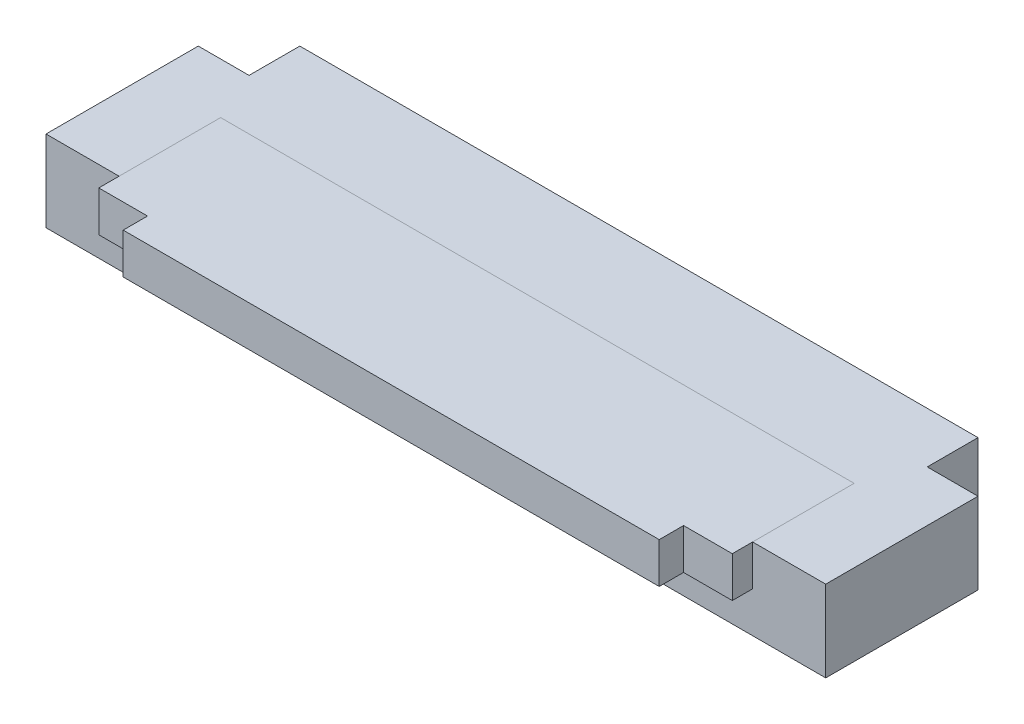
ISO-10303-21;
HEADER;
FILE_DESCRIPTION(('STEP AP214'),'2;1');
FILE_NAME('part.step','',(''),(''),'','','');
FILE_SCHEMA(('AUTOMOTIVE_DESIGN { 1 0 10303 214 1 1 1 1 }'));
ENDSEC;
DATA;
#1=APPLICATION_CONTEXT('core data for automotive mechanical design processes');
#2=APPLICATION_PROTOCOL_DEFINITION('international standard','automotive_design',2000,#1);
#3=PRODUCT_CONTEXT('',#1,'mechanical');
#4=PRODUCT('Part','Part','',(#3));
#5=PRODUCT_RELATED_PRODUCT_CATEGORY('part','',(#4));
#6=PRODUCT_DEFINITION_FORMATION('','',#4);
#7=PRODUCT_DEFINITION_CONTEXT('part definition',#1,'design');
#8=PRODUCT_DEFINITION('design','',#6,#7);
#9=PRODUCT_DEFINITION_SHAPE('','',#8);
#10=(LENGTH_UNIT() NAMED_UNIT(*) SI_UNIT(.MILLI.,.METRE.));
#11=(NAMED_UNIT(*) PLANE_ANGLE_UNIT() SI_UNIT($,.RADIAN.));
#12=(NAMED_UNIT(*) SI_UNIT($,.STERADIAN.) SOLID_ANGLE_UNIT());
#13=UNCERTAINTY_MEASURE_WITH_UNIT(LENGTH_MEASURE(1.E-05),#10,'distance_accuracy_value','');
#14=(GEOMETRIC_REPRESENTATION_CONTEXT(3) GLOBAL_UNCERTAINTY_ASSIGNED_CONTEXT((#13)) GLOBAL_UNIT_ASSIGNED_CONTEXT((#10,
#11,#12)) REPRESENTATION_CONTEXT('',''));
#15=CARTESIAN_POINT('',(0.,0.,0.));
#16=DIRECTION('',(0.,0.,1.));
#17=DIRECTION('',(1.,0.,0.));
#18=AXIS2_PLACEMENT_3D('',#15,#16,#17);
#19=CARTESIAN_POINT('',(-4.8,0.,-1.25));
#20=DIRECTION('',(-1.,0.,0.));
#21=DIRECTION('',(0.,0.,1.));
#22=AXIS2_PLACEMENT_3D('',#19,#20,#21);
#23=PLANE('',#22);
#24=DIRECTION('',(0.,-1.,0.));
#25=VECTOR('',#24,1.);
#26=CARTESIAN_POINT('',(-4.8,1.,-0.625));
#27=LINE('',#26,#25);
#28=CARTESIAN_POINT('',(-4.8,1.,-0.625));
#29=VERTEX_POINT('',#28);
#30=CARTESIAN_POINT('',(-4.8,0.,-0.625));
#31=VERTEX_POINT('',#30);
#32=EDGE_CURVE('E169',#29,#31,#27,.T.);
#33=ORIENTED_EDGE('',*,*,#32,.T.);
#34=DIRECTION('',(0.,0.,1.));
#35=VECTOR('',#34,1.);
#36=CARTESIAN_POINT('',(-4.8,0.,-1.25));
#37=LINE('',#36,#35);
#38=CARTESIAN_POINT('',(-4.8,0.,1.25));
#39=VERTEX_POINT('',#38);
#40=EDGE_CURVE('E194',#31,#39,#37,.T.);
#41=ORIENTED_EDGE('',*,*,#40,.T.);
#42=DIRECTION('',(0.,1.,0.));
#43=VECTOR('',#42,1.);
#44=CARTESIAN_POINT('',(-4.8,0.,1.25));
#45=LINE('',#44,#43);
#46=CARTESIAN_POINT('',(-4.8,1.,1.25));
#47=VERTEX_POINT('',#46);
#48=EDGE_CURVE('E46',#39,#47,#45,.T.);
#49=ORIENTED_EDGE('',*,*,#48,.T.);
#50=DIRECTION('',(0.,0.,1.));
#51=VECTOR('',#50,1.);
#52=CARTESIAN_POINT('',(-4.8,1.,-1.25));
#53=LINE('',#52,#51);
#54=EDGE_CURVE('E190',#29,#47,#53,.T.);
#55=ORIENTED_EDGE('',*,*,#54,.F.);
#56=EDGE_LOOP('',(#33,#41,#49,#55));
#57=FACE_BOUND('',#56,.T.);
#58=ADVANCED_FACE('F43',(#57),#23,.T.);
#59=CARTESIAN_POINT('',(4.8,0.,-1.25));
#60=DIRECTION('',(0.,0.,-1.));
#61=DIRECTION('',(-1.,0.,0.));
#62=AXIS2_PLACEMENT_3D('',#59,#60,#61);
#63=PLANE('',#62);
#64=DIRECTION('',(0.,-1.,0.));
#65=VECTOR('',#64,1.);
#66=CARTESIAN_POINT('',(-4.175,1.,-1.25));
#67=LINE('',#66,#65);
#68=CARTESIAN_POINT('',(-4.175,1.,-1.25));
#69=VERTEX_POINT('',#68);
#70=CARTESIAN_POINT('',(-4.175,0.,-1.25));
#71=VERTEX_POINT('',#70);
#72=EDGE_CURVE('E163',#69,#71,#67,.T.);
#73=ORIENTED_EDGE('',*,*,#72,.F.);
#74=DIRECTION('',(-1.,0.,0.));
#75=VECTOR('',#74,1.);
#76=CARTESIAN_POINT('',(4.8,1.,-1.25));
#77=LINE('',#76,#75);
#78=CARTESIAN_POINT('',(4.175,1.,-1.25));
#79=VERTEX_POINT('',#78);
#80=EDGE_CURVE('E197',#79,#69,#77,.T.);
#81=ORIENTED_EDGE('',*,*,#80,.F.);
#82=DIRECTION('',(0.,-1.,0.));
#83=VECTOR('',#82,1.);
#84=CARTESIAN_POINT('',(4.175,1.,-1.25));
#85=LINE('',#84,#83);
#86=CARTESIAN_POINT('',(4.175,0.,-1.25));
#87=VERTEX_POINT('',#86);
#88=EDGE_CURVE('E187',#79,#87,#85,.T.);
#89=ORIENTED_EDGE('',*,*,#88,.T.);
#90=DIRECTION('',(-1.,0.,0.));
#91=VECTOR('',#90,1.);
#92=CARTESIAN_POINT('',(4.8,0.,-1.25));
#93=LINE('',#92,#91);
#94=EDGE_CURVE('E203',#87,#71,#93,.T.);
#95=ORIENTED_EDGE('',*,*,#94,.T.);
#96=EDGE_LOOP('',(#73,#81,#89,#95));
#97=FACE_BOUND('',#96,.T.);
#98=ADVANCED_FACE('F220',(#97),#63,.T.);
#99=CARTESIAN_POINT('',(4.8,0.,1.25));
#100=DIRECTION('',(1.,0.,0.));
#101=DIRECTION('',(0.,0.,-1.));
#102=AXIS2_PLACEMENT_3D('',#99,#100,#101);
#103=PLANE('',#102);
#104=DIRECTION('',(0.,-1.,0.));
#105=VECTOR('',#104,1.);
#106=CARTESIAN_POINT('',(4.8,1.,-0.625));
#107=LINE('',#106,#105);
#108=CARTESIAN_POINT('',(4.8,1.,-0.625));
#109=VERTEX_POINT('',#108);
#110=CARTESIAN_POINT('',(4.8,0.,-0.625));
#111=VERTEX_POINT('',#110);
#112=EDGE_CURVE('E183',#109,#111,#107,.T.);
#113=ORIENTED_EDGE('',*,*,#112,.F.);
#114=DIRECTION('',(0.,0.,-1.));
#115=VECTOR('',#114,1.);
#116=CARTESIAN_POINT('',(4.8,1.,1.25));
#117=LINE('',#116,#115);
#118=CARTESIAN_POINT('',(4.8,1.,1.25));
#119=VERTEX_POINT('',#118);
#120=EDGE_CURVE('E210',#119,#109,#117,.T.);
#121=ORIENTED_EDGE('',*,*,#120,.F.);
#122=DIRECTION('',(0.,1.,0.));
#123=VECTOR('',#122,1.);
#124=CARTESIAN_POINT('',(4.8,0.,1.25));
#125=LINE('',#124,#123);
#126=CARTESIAN_POINT('',(4.8,0.,1.25));
#127=VERTEX_POINT('',#126);
#128=EDGE_CURVE('E12',#127,#119,#125,.T.);
#129=ORIENTED_EDGE('',*,*,#128,.F.);
#130=DIRECTION('',(0.,0.,-1.));
#131=VECTOR('',#130,1.);
#132=CARTESIAN_POINT('',(4.8,0.,1.25));
#133=LINE('',#132,#131);
#134=EDGE_CURVE('E200',#127,#111,#133,.T.);
#135=ORIENTED_EDGE('',*,*,#134,.T.);
#136=EDGE_LOOP('',(#113,#121,#129,#135));
#137=FACE_BOUND('',#136,.T.);
#138=ADVANCED_FACE('F254',(#137),#103,.T.);
#139=CARTESIAN_POINT('',(-4.8,0.,1.25));
#140=DIRECTION('',(0.,0.,1.));
#141=DIRECTION('',(1.,0.,0.));
#142=AXIS2_PLACEMENT_3D('',#139,#140,#141);
#143=PLANE('',#142);
#144=DIRECTION('',(0.,1.,0.));
#145=VECTOR('',#144,1.);
#146=CARTESIAN_POINT('',(-3.9,0.5,1.25));
#147=LINE('',#146,#145);
#148=CARTESIAN_POINT('',(-3.9,0.5,1.25));
#149=VERTEX_POINT('',#148);
#150=CARTESIAN_POINT('',(-3.9,1.,1.25));
#151=VERTEX_POINT('',#150);
#152=EDGE_CURVE('E167',#149,#151,#147,.T.);
#153=ORIENTED_EDGE('',*,*,#152,.T.);
#154=DIRECTION('',(1.,0.,0.));
#155=VECTOR('',#154,1.);
#156=CARTESIAN_POINT('',(-4.8,1.,1.25));
#157=LINE('',#156,#155);
#158=EDGE_CURVE('E207',#47,#151,#157,.T.);
#159=ORIENTED_EDGE('',*,*,#158,.F.);
#160=ORIENTED_EDGE('',*,*,#48,.F.);
#161=DIRECTION('',(1.,0.,0.));
#162=VECTOR('',#161,1.);
#163=CARTESIAN_POINT('',(-4.8,0.,1.25));
#164=LINE('',#163,#162);
#165=EDGE_CURVE('E196',#39,#127,#164,.T.);
#166=ORIENTED_EDGE('',*,*,#165,.T.);
#167=ORIENTED_EDGE('',*,*,#128,.T.);
#168=CARTESIAN_POINT('',(3.9,1.,1.25));
#169=VERTEX_POINT('',#168);
#170=EDGE_CURVE('E151',#169,#119,#157,.T.);
#171=ORIENTED_EDGE('',*,*,#170,.F.);
#172=DIRECTION('',(0.,1.,0.));
#173=VECTOR('',#172,1.);
#174=CARTESIAN_POINT('',(3.9,0.5,1.25));
#175=LINE('',#174,#173);
#176=CARTESIAN_POINT('',(3.9,0.5,1.25));
#177=VERTEX_POINT('',#176);
#178=EDGE_CURVE('E57',#177,#169,#175,.T.);
#179=ORIENTED_EDGE('',*,*,#178,.F.);
#180=DIRECTION('',(1.,0.,0.));
#181=VECTOR('',#180,1.);
#182=CARTESIAN_POINT('',(-3.9,0.5,1.25));
#183=LINE('',#182,#181);
#184=EDGE_CURVE('E138',#149,#177,#183,.T.);
#185=ORIENTED_EDGE('',*,*,#184,.F.);
#186=EDGE_LOOP('',(#153,#159,#160,#166,#167,#171,#179,#185));
#187=FACE_BOUND('',#186,.T.);
#188=ADVANCED_FACE('F150',(#187),#143,.T.);
#189=CARTESIAN_POINT('',(-4.8,0.,1.25));
#190=DIRECTION('',(0.,1.,0.));
#191=DIRECTION('',(0.,0.,1.));
#192=AXIS2_PLACEMENT_3D('',#189,#190,#191);
#193=PLANE('',#192);
#194=ORIENTED_EDGE('',*,*,#40,.F.);
#195=DIRECTION('',(-1.,0.,0.));
#196=VECTOR('',#195,1.);
#197=CARTESIAN_POINT('',(-4.175,0.,-0.625));
#198=LINE('',#197,#196);
#199=CARTESIAN_POINT('',(-4.175,0.,-0.625));
#200=VERTEX_POINT('',#199);
#201=EDGE_CURVE('E161',#200,#31,#198,.T.);
#202=ORIENTED_EDGE('',*,*,#201,.F.);
#203=DIRECTION('',(0.,0.,1.));
#204=VECTOR('',#203,1.);
#205=CARTESIAN_POINT('',(-4.175,0.,-1.25));
#206=LINE('',#205,#204);
#207=EDGE_CURVE('E164',#71,#200,#206,.T.);
#208=ORIENTED_EDGE('',*,*,#207,.F.);
#209=ORIENTED_EDGE('',*,*,#94,.F.);
#210=DIRECTION('',(0.,0.,-1.));
#211=VECTOR('',#210,1.);
#212=CARTESIAN_POINT('',(4.175,0.,-0.625));
#213=LINE('',#212,#211);
#214=CARTESIAN_POINT('',(4.175,0.,-0.625));
#215=VERTEX_POINT('',#214);
#216=EDGE_CURVE('E180',#215,#87,#213,.T.);
#217=ORIENTED_EDGE('',*,*,#216,.F.);
#218=DIRECTION('',(-1.,0.,0.));
#219=VECTOR('',#218,1.);
#220=CARTESIAN_POINT('',(4.8,0.,-0.625));
#221=LINE('',#220,#219);
#222=EDGE_CURVE('E172',#111,#215,#221,.T.);
#223=ORIENTED_EDGE('',*,*,#222,.F.);
#224=ORIENTED_EDGE('',*,*,#134,.F.);
#225=ORIENTED_EDGE('',*,*,#165,.F.);
#226=EDGE_LOOP('',(#194,#202,#208,#209,#217,#223,#224,#225));
#227=FACE_BOUND('',#226,.T.);
#228=ADVANCED_FACE('F228',(#227),#193,.F.);
#229=CARTESIAN_POINT('',(-4.8,1.,1.25));
#230=DIRECTION('',(0.,1.,0.));
#231=DIRECTION('',(0.,0.,1.));
#232=AXIS2_PLACEMENT_3D('',#229,#230,#231);
#233=PLANE('',#232);
#234=DIRECTION('',(0.,0.,1.));
#235=VECTOR('',#234,1.);
#236=CARTESIAN_POINT('',(-3.9,1.,0.));
#237=LINE('',#236,#235);
#238=CARTESIAN_POINT('',(-3.9,1.,0.));
#239=VERTEX_POINT('',#238);
#240=EDGE_CURVE('E147',#239,#151,#237,.T.);
#241=ORIENTED_EDGE('',*,*,#240,.F.);
#242=DIRECTION('',(-1.,0.,0.));
#243=VECTOR('',#242,1.);
#244=CARTESIAN_POINT('',(3.9,1.,0.));
#245=LINE('',#244,#243);
#246=CARTESIAN_POINT('',(3.9,1.,0.));
#247=VERTEX_POINT('',#246);
#248=EDGE_CURVE('E242',#247,#239,#245,.T.);
#249=ORIENTED_EDGE('',*,*,#248,.F.);
#250=DIRECTION('',(0.,0.,-1.));
#251=VECTOR('',#250,1.);
#252=CARTESIAN_POINT('',(3.9,1.,1.25));
#253=LINE('',#252,#251);
#254=EDGE_CURVE('E245',#169,#247,#253,.T.);
#255=ORIENTED_EDGE('',*,*,#254,.F.);
#256=ORIENTED_EDGE('',*,*,#170,.T.);
#257=ORIENTED_EDGE('',*,*,#120,.T.);
#258=DIRECTION('',(-1.,0.,0.));
#259=VECTOR('',#258,1.);
#260=CARTESIAN_POINT('',(4.8,1.,-0.625));
#261=LINE('',#260,#259);
#262=CARTESIAN_POINT('',(4.175,1.,-0.625));
#263=VERTEX_POINT('',#262);
#264=EDGE_CURVE('E176',#109,#263,#261,.T.);
#265=ORIENTED_EDGE('',*,*,#264,.T.);
#266=DIRECTION('',(0.,0.,-1.));
#267=VECTOR('',#266,1.);
#268=CARTESIAN_POINT('',(4.175,1.,-0.625));
#269=LINE('',#268,#267);
#270=EDGE_CURVE('E179',#263,#79,#269,.T.);
#271=ORIENTED_EDGE('',*,*,#270,.T.);
#272=ORIENTED_EDGE('',*,*,#80,.T.);
#273=DIRECTION('',(0.,0.,1.));
#274=VECTOR('',#273,1.);
#275=CARTESIAN_POINT('',(-4.175,1.,-1.25));
#276=LINE('',#275,#274);
#277=CARTESIAN_POINT('',(-4.175,1.,-0.625));
#278=VERTEX_POINT('',#277);
#279=EDGE_CURVE('E158',#69,#278,#276,.T.);
#280=ORIENTED_EDGE('',*,*,#279,.T.);
#281=DIRECTION('',(-1.,0.,0.));
#282=VECTOR('',#281,1.);
#283=CARTESIAN_POINT('',(-4.175,1.,-0.625));
#284=LINE('',#283,#282);
#285=EDGE_CURVE('E65',#278,#29,#284,.T.);
#286=ORIENTED_EDGE('',*,*,#285,.T.);
#287=ORIENTED_EDGE('',*,*,#54,.T.);
#288=ORIENTED_EDGE('',*,*,#158,.T.);
#289=EDGE_LOOP('',(#241,#249,#255,#256,#257,#265,#271,#272,#280,#286,#287,#288));
#290=FACE_BOUND('',#289,.T.);
#291=ADVANCED_FACE('F217',(#290),#233,.T.);
#292=CARTESIAN_POINT('',(4.175,1.,-0.625));
#293=DIRECTION('',(-1.,0.,0.));
#294=DIRECTION('',(0.,0.,1.));
#295=AXIS2_PLACEMENT_3D('',#292,#293,#294);
#296=PLANE('',#295);
#297=ORIENTED_EDGE('',*,*,#216,.T.);
#298=ORIENTED_EDGE('',*,*,#88,.F.);
#299=ORIENTED_EDGE('',*,*,#270,.F.);
#300=DIRECTION('',(0.,-1.,0.));
#301=VECTOR('',#300,1.);
#302=CARTESIAN_POINT('',(4.175,1.,-0.625));
#303=LINE('',#302,#301);
#304=EDGE_CURVE('E191',#263,#215,#303,.T.);
#305=ORIENTED_EDGE('',*,*,#304,.T.);
#306=EDGE_LOOP('',(#297,#298,#299,#305));
#307=FACE_BOUND('',#306,.T.);
#308=ADVANCED_FACE('F260',(#307),#296,.F.);
#309=CARTESIAN_POINT('',(4.8,1.,-0.625));
#310=DIRECTION('',(0.,0.,1.));
#311=DIRECTION('',(1.,0.,0.));
#312=AXIS2_PLACEMENT_3D('',#309,#310,#311);
#313=PLANE('',#312);
#314=ORIENTED_EDGE('',*,*,#222,.T.);
#315=ORIENTED_EDGE('',*,*,#304,.F.);
#316=ORIENTED_EDGE('',*,*,#264,.F.);
#317=ORIENTED_EDGE('',*,*,#112,.T.);
#318=EDGE_LOOP('',(#314,#315,#316,#317));
#319=FACE_BOUND('',#318,.T.);
#320=ADVANCED_FACE('F257',(#319),#313,.F.);
#321=CARTESIAN_POINT('',(-4.175,1.,-0.625));
#322=DIRECTION('',(0.,0.,1.));
#323=DIRECTION('',(1.,0.,0.));
#324=AXIS2_PLACEMENT_3D('',#321,#322,#323);
#325=PLANE('',#324);
#326=ORIENTED_EDGE('',*,*,#201,.T.);
#327=ORIENTED_EDGE('',*,*,#32,.F.);
#328=ORIENTED_EDGE('',*,*,#285,.F.);
#329=DIRECTION('',(0.,-1.,0.));
#330=VECTOR('',#329,1.);
#331=CARTESIAN_POINT('',(-4.175,1.,-0.625));
#332=LINE('',#331,#330);
#333=EDGE_CURVE('E173',#278,#200,#332,.T.);
#334=ORIENTED_EDGE('',*,*,#333,.T.);
#335=EDGE_LOOP('',(#326,#327,#328,#334));
#336=FACE_BOUND('',#335,.T.);
#337=ADVANCED_FACE('F231',(#336),#325,.F.);
#338=CARTESIAN_POINT('',(-4.175,1.,-1.25));
#339=DIRECTION('',(1.,0.,0.));
#340=DIRECTION('',(0.,0.,-1.));
#341=AXIS2_PLACEMENT_3D('',#338,#339,#340);
#342=PLANE('',#341);
#343=ORIENTED_EDGE('',*,*,#207,.T.);
#344=ORIENTED_EDGE('',*,*,#333,.F.);
#345=ORIENTED_EDGE('',*,*,#279,.F.);
#346=ORIENTED_EDGE('',*,*,#72,.T.);
#347=EDGE_LOOP('',(#343,#344,#345,#346));
#348=FACE_BOUND('',#347,.T.);
#349=ADVANCED_FACE('F224',(#348),#342,.F.);
#350=CARTESIAN_POINT('',(-3.9,0.5,0.));
#351=DIRECTION('',(-1.,0.,0.));
#352=DIRECTION('',(0.,0.,1.));
#353=AXIS2_PLACEMENT_3D('',#350,#351,#352);
#354=PLANE('',#353);
#355=ORIENTED_EDGE('',*,*,#240,.T.);
#356=ORIENTED_EDGE('',*,*,#152,.F.);
#357=DIRECTION('',(0.,0.,1.));
#358=VECTOR('',#357,1.);
#359=CARTESIAN_POINT('',(-3.9,0.5,0.));
#360=LINE('',#359,#358);
#361=CARTESIAN_POINT('',(-3.9,0.5,0.));
#362=VERTEX_POINT('',#361);
#363=EDGE_CURVE('E144',#362,#149,#360,.T.);
#364=ORIENTED_EDGE('',*,*,#363,.F.);
#365=DIRECTION('',(0.,1.,0.));
#366=VECTOR('',#365,1.);
#367=CARTESIAN_POINT('',(-3.9,0.5,0.));
#368=LINE('',#367,#366);
#369=EDGE_CURVE('E153',#362,#239,#368,.T.);
#370=ORIENTED_EDGE('',*,*,#369,.T.);
#371=EDGE_LOOP('',(#355,#356,#364,#370));
#372=FACE_BOUND('',#371,.T.);
#373=ADVANCED_FACE('F248',(#372),#354,.F.);
#374=CARTESIAN_POINT('',(3.9,0.5,0.));
#375=DIRECTION('',(0.,0.,-1.));
#376=DIRECTION('',(-1.,0.,0.));
#377=AXIS2_PLACEMENT_3D('',#374,#375,#376);
#378=PLANE('',#377);
#379=ORIENTED_EDGE('',*,*,#248,.T.);
#380=ORIENTED_EDGE('',*,*,#369,.F.);
#381=DIRECTION('',(-1.,0.,0.));
#382=VECTOR('',#381,1.);
#383=CARTESIAN_POINT('',(3.9,0.5,0.));
#384=LINE('',#383,#382);
#385=CARTESIAN_POINT('',(3.9,0.5,0.));
#386=VERTEX_POINT('',#385);
#387=EDGE_CURVE('E137',#386,#362,#384,.T.);
#388=ORIENTED_EDGE('',*,*,#387,.F.);
#389=DIRECTION('',(0.,1.,0.));
#390=VECTOR('',#389,1.);
#391=CARTESIAN_POINT('',(3.9,0.5,0.));
#392=LINE('',#391,#390);
#393=EDGE_CURVE('E133',#386,#247,#392,.T.);
#394=ORIENTED_EDGE('',*,*,#393,.T.);
#395=EDGE_LOOP('',(#379,#380,#388,#394));
#396=FACE_BOUND('',#395,.T.);
#397=ADVANCED_FACE('F249',(#396),#378,.F.);
#398=CARTESIAN_POINT('',(3.9,0.5,1.25));
#399=DIRECTION('',(1.,0.,0.));
#400=DIRECTION('',(0.,0.,-1.));
#401=AXIS2_PLACEMENT_3D('',#398,#399,#400);
#402=PLANE('',#401);
#403=ORIENTED_EDGE('',*,*,#254,.T.);
#404=ORIENTED_EDGE('',*,*,#393,.F.);
#405=DIRECTION('',(0.,0.,-1.));
#406=VECTOR('',#405,1.);
#407=CARTESIAN_POINT('',(3.9,0.5,1.25));
#408=LINE('',#407,#406);
#409=EDGE_CURVE('E130',#177,#386,#408,.T.);
#410=ORIENTED_EDGE('',*,*,#409,.F.);
#411=ORIENTED_EDGE('',*,*,#178,.T.);
#412=EDGE_LOOP('',(#403,#404,#410,#411));
#413=FACE_BOUND('',#412,.T.);
#414=ADVANCED_FACE('F132',(#413),#402,.F.);
#415=CARTESIAN_POINT('',(3.9,0.5,1.25));
#416=DIRECTION('',(0.,1.,0.));
#417=DIRECTION('',(0.,0.,1.));
#418=AXIS2_PLACEMENT_3D('',#415,#416,#417);
#419=PLANE('',#418);
#420=ORIENTED_EDGE('',*,*,#184,.T.);
#421=ORIENTED_EDGE('',*,*,#409,.T.);
#422=ORIENTED_EDGE('',*,*,#387,.T.);
#423=ORIENTED_EDGE('',*,*,#363,.T.);
#424=EDGE_LOOP('',(#420,#421,#422,#423));
#425=FACE_BOUND('',#424,.T.);
#426=ADVANCED_FACE('F142',(#425),#419,.T.);
#427=CLOSED_SHELL('',(#58,#98,#138,#188,#228,#291,#308,#320,#337,#349,#373,#397,#414,#426));
#428=MANIFOLD_SOLID_BREP('B2',#427);
#429=CARTESIAN_POINT('',(3.3,0.5,1.5));
#430=DIRECTION('',(0.,0.,1.));
#431=DIRECTION('',(1.,0.,0.));
#432=AXIS2_PLACEMENT_3D('',#429,#430,#431);
#433=PLANE('',#432);
#434=DIRECTION('',(1.,0.,0.));
#435=VECTOR('',#434,1.);
#436=CARTESIAN_POINT('',(3.3,1.,1.5));
#437=LINE('',#436,#435);
#438=CARTESIAN_POINT('',(3.3,1.,1.5));
#439=VERTEX_POINT('',#438);
#440=CARTESIAN_POINT('',(3.9,1.,1.5));
#441=VERTEX_POINT('',#440);
#442=EDGE_CURVE('E471',#439,#441,#437,.T.);
#443=ORIENTED_EDGE('',*,*,#442,.F.);
#444=DIRECTION('',(0.,1.,0.));
#445=VECTOR('',#444,1.);
#446=CARTESIAN_POINT('',(3.3,0.5,1.5));
#447=LINE('',#446,#445);
#448=CARTESIAN_POINT('',(3.3,0.5,1.5));
#449=VERTEX_POINT('',#448);
#450=EDGE_CURVE('E41',#449,#439,#447,.T.);
#451=ORIENTED_EDGE('',*,*,#450,.F.);
#452=DIRECTION('',(1.,0.,0.));
#453=VECTOR('',#452,1.);
#454=CARTESIAN_POINT('',(3.3,0.5,1.5));
#455=LINE('',#454,#453);
#456=CARTESIAN_POINT('',(3.9,0.5,1.5));
#457=VERTEX_POINT('',#456);
#458=EDGE_CURVE('E491',#449,#457,#455,.T.);
#459=ORIENTED_EDGE('',*,*,#458,.T.);
#460=DIRECTION('',(0.,1.,0.));
#461=VECTOR('',#460,1.);
#462=CARTESIAN_POINT('',(3.9,0.5,1.5));
#463=LINE('',#462,#461);
#464=EDGE_CURVE('E377',#457,#441,#463,.T.);
#465=ORIENTED_EDGE('',*,*,#464,.T.);
#466=EDGE_LOOP('',(#443,#451,#459,#465));
#467=FACE_BOUND('',#466,.T.);
#468=ADVANCED_FACE('F374',(#467),#433,.T.);
#469=CARTESIAN_POINT('',(3.3,0.5,1.8));
#470=DIRECTION('',(1.,0.,0.));
#471=DIRECTION('',(0.,0.,-1.));
#472=AXIS2_PLACEMENT_3D('',#469,#470,#471);
#473=PLANE('',#472);
#474=DIRECTION('',(0.,0.,-1.));
#475=VECTOR('',#474,1.);
#476=CARTESIAN_POINT('',(3.3,1.,1.8));
#477=LINE('',#476,#475);
#478=CARTESIAN_POINT('',(3.3,1.,1.8));
#479=VERTEX_POINT('',#478);
#480=EDGE_CURVE('E489',#479,#439,#477,.T.);
#481=ORIENTED_EDGE('',*,*,#480,.F.);
#482=DIRECTION('',(0.,1.,0.));
#483=VECTOR('',#482,1.);
#484=CARTESIAN_POINT('',(3.3,0.5,1.8));
#485=LINE('',#484,#483);
#486=CARTESIAN_POINT('',(3.3,0.5,1.8));
#487=VERTEX_POINT('',#486);
#488=EDGE_CURVE('E383',#487,#479,#485,.T.);
#489=ORIENTED_EDGE('',*,*,#488,.F.);
#490=DIRECTION('',(0.,0.,-1.));
#491=VECTOR('',#490,1.);
#492=CARTESIAN_POINT('',(3.3,0.5,1.8));
#493=LINE('',#492,#491);
#494=EDGE_CURVE('E461',#487,#449,#493,.T.);
#495=ORIENTED_EDGE('',*,*,#494,.T.);
#496=ORIENTED_EDGE('',*,*,#450,.T.);
#497=EDGE_LOOP('',(#481,#489,#495,#496));
#498=FACE_BOUND('',#497,.T.);
#499=ADVANCED_FACE('F503',(#498),#473,.T.);
#500=CARTESIAN_POINT('',(-3.3,0.5,1.8));
#501=DIRECTION('',(0.,0.,1.));
#502=DIRECTION('',(1.,0.,0.));
#503=AXIS2_PLACEMENT_3D('',#500,#501,#502);
#504=PLANE('',#503);
#505=DIRECTION('',(1.,0.,0.));
#506=VECTOR('',#505,1.);
#507=CARTESIAN_POINT('',(-3.3,1.,1.8));
#508=LINE('',#507,#506);
#509=CARTESIAN_POINT('',(-3.3,1.,1.8));
#510=VERTEX_POINT('',#509);
#511=EDGE_CURVE('E448',#510,#479,#508,.T.);
#512=ORIENTED_EDGE('',*,*,#511,.F.);
#513=DIRECTION('',(0.,1.,0.));
#514=VECTOR('',#513,1.);
#515=CARTESIAN_POINT('',(-3.3,0.5,1.8));
#516=LINE('',#515,#514);
#517=CARTESIAN_POINT('',(-3.3,0.5,1.8));
#518=VERTEX_POINT('',#517);
#519=EDGE_CURVE('E443',#518,#510,#516,.T.);
#520=ORIENTED_EDGE('',*,*,#519,.F.);
#521=DIRECTION('',(1.,0.,0.));
#522=VECTOR('',#521,1.);
#523=CARTESIAN_POINT('',(-3.3,0.5,1.8));
#524=LINE('',#523,#522);
#525=EDGE_CURVE('E446',#518,#487,#524,.T.);
#526=ORIENTED_EDGE('',*,*,#525,.T.);
#527=ORIENTED_EDGE('',*,*,#488,.T.);
#528=EDGE_LOOP('',(#512,#520,#526,#527));
#529=FACE_BOUND('',#528,.T.);
#530=ADVANCED_FACE('F445',(#529),#504,.T.);
#531=CARTESIAN_POINT('',(-3.3,0.5,1.5));
#532=DIRECTION('',(-1.,0.,0.));
#533=DIRECTION('',(0.,0.,1.));
#534=AXIS2_PLACEMENT_3D('',#531,#532,#533);
#535=PLANE('',#534);
#536=DIRECTION('',(0.,0.,1.));
#537=VECTOR('',#536,1.);
#538=CARTESIAN_POINT('',(-3.3,1.,1.5));
#539=LINE('',#538,#537);
#540=CARTESIAN_POINT('',(-3.3,1.,1.5));
#541=VERTEX_POINT('',#540);
#542=EDGE_CURVE('E486',#541,#510,#539,.T.);
#543=ORIENTED_EDGE('',*,*,#542,.F.);
#544=DIRECTION('',(0.,1.,0.));
#545=VECTOR('',#544,1.);
#546=CARTESIAN_POINT('',(-3.3,0.5,1.5));
#547=LINE('',#546,#545);
#548=CARTESIAN_POINT('',(-3.3,0.5,1.5));
#549=VERTEX_POINT('',#548);
#550=EDGE_CURVE('E453',#549,#541,#547,.T.);
#551=ORIENTED_EDGE('',*,*,#550,.F.);
#552=DIRECTION('',(0.,0.,1.));
#553=VECTOR('',#552,1.);
#554=CARTESIAN_POINT('',(-3.3,0.5,1.5));
#555=LINE('',#554,#553);
#556=EDGE_CURVE('E459',#549,#518,#555,.T.);
#557=ORIENTED_EDGE('',*,*,#556,.T.);
#558=ORIENTED_EDGE('',*,*,#519,.T.);
#559=EDGE_LOOP('',(#543,#551,#557,#558));
#560=FACE_BOUND('',#559,.T.);
#561=ADVANCED_FACE('F463',(#560),#535,.T.);
#562=CARTESIAN_POINT('',(-3.9,0.5,1.5));
#563=DIRECTION('',(0.,0.,1.));
#564=DIRECTION('',(1.,0.,0.));
#565=AXIS2_PLACEMENT_3D('',#562,#563,#564);
#566=PLANE('',#565);
#567=DIRECTION('',(1.,0.,0.));
#568=VECTOR('',#567,1.);
#569=CARTESIAN_POINT('',(-3.9,1.,1.5));
#570=LINE('',#569,#568);
#571=CARTESIAN_POINT('',(-3.9,1.,1.5));
#572=VERTEX_POINT('',#571);
#573=EDGE_CURVE('E483',#572,#541,#570,.T.);
#574=ORIENTED_EDGE('',*,*,#573,.F.);
#575=DIRECTION('',(0.,1.,0.));
#576=VECTOR('',#575,1.);
#577=CARTESIAN_POINT('',(-3.9,0.5,1.5));
#578=LINE('',#577,#576);
#579=CARTESIAN_POINT('',(-3.9,0.5,1.5));
#580=VERTEX_POINT('',#579);
#581=EDGE_CURVE('E495',#580,#572,#578,.T.);
#582=ORIENTED_EDGE('',*,*,#581,.F.);
#583=DIRECTION('',(1.,0.,0.));
#584=VECTOR('',#583,1.);
#585=CARTESIAN_POINT('',(-3.9,0.5,1.5));
#586=LINE('',#585,#584);
#587=EDGE_CURVE('E464',#580,#549,#586,.T.);
#588=ORIENTED_EDGE('',*,*,#587,.T.);
#589=ORIENTED_EDGE('',*,*,#550,.T.);
#590=EDGE_LOOP('',(#574,#582,#588,#589));
#591=FACE_BOUND('',#590,.T.);
#592=ADVANCED_FACE('F516',(#591),#566,.T.);
#593=CARTESIAN_POINT('',(-3.9,0.5,0.));
#594=DIRECTION('',(-1.,0.,0.));
#595=DIRECTION('',(0.,0.,1.));
#596=AXIS2_PLACEMENT_3D('',#593,#594,#595);
#597=PLANE('',#596);
#598=DIRECTION('',(0.,0.,1.));
#599=VECTOR('',#598,1.);
#600=CARTESIAN_POINT('',(-3.9,1.,0.));
#601=LINE('',#600,#599);
#602=CARTESIAN_POINT('',(-3.9,1.,0.));
#603=VERTEX_POINT('',#602);
#604=EDGE_CURVE('E480',#603,#572,#601,.T.);
#605=ORIENTED_EDGE('',*,*,#604,.F.);
#606=DIRECTION('',(0.,1.,0.));
#607=VECTOR('',#606,1.);
#608=CARTESIAN_POINT('',(-3.9,0.5,0.));
#609=LINE('',#608,#607);
#610=CARTESIAN_POINT('',(-3.9,0.5,0.));
#611=VERTEX_POINT('',#610);
#612=EDGE_CURVE('E497',#611,#603,#609,.T.);
#613=ORIENTED_EDGE('',*,*,#612,.F.);
#614=DIRECTION('',(0.,0.,1.));
#615=VECTOR('',#614,1.);
#616=CARTESIAN_POINT('',(-3.9,0.5,0.));
#617=LINE('',#616,#615);
#618=EDGE_CURVE('E466',#611,#580,#617,.T.);
#619=ORIENTED_EDGE('',*,*,#618,.T.);
#620=ORIENTED_EDGE('',*,*,#581,.T.);
#621=EDGE_LOOP('',(#605,#613,#619,#620));
#622=FACE_BOUND('',#621,.T.);
#623=ADVANCED_FACE('F519',(#622),#597,.T.);
#624=CARTESIAN_POINT('',(3.9,0.5,0.));
#625=DIRECTION('',(0.,0.,-1.));
#626=DIRECTION('',(-1.,0.,0.));
#627=AXIS2_PLACEMENT_3D('',#624,#625,#626);
#628=PLANE('',#627);
#629=DIRECTION('',(-1.,0.,0.));
#630=VECTOR('',#629,1.);
#631=CARTESIAN_POINT('',(3.9,1.,0.));
#632=LINE('',#631,#630);
#633=CARTESIAN_POINT('',(3.9,1.,0.));
#634=VERTEX_POINT('',#633);
#635=EDGE_CURVE('E477',#634,#603,#632,.T.);
#636=ORIENTED_EDGE('',*,*,#635,.F.);
#637=DIRECTION('',(0.,1.,0.));
#638=VECTOR('',#637,1.);
#639=CARTESIAN_POINT('',(3.9,0.5,0.));
#640=LINE('',#639,#638);
#641=CARTESIAN_POINT('',(3.9,0.5,0.));
#642=VERTEX_POINT('',#641);
#643=EDGE_CURVE('E498',#642,#634,#640,.T.);
#644=ORIENTED_EDGE('',*,*,#643,.F.);
#645=DIRECTION('',(-1.,0.,0.));
#646=VECTOR('',#645,1.);
#647=CARTESIAN_POINT('',(3.9,0.5,0.));
#648=LINE('',#647,#646);
#649=EDGE_CURVE('E594',#642,#611,#648,.T.);
#650=ORIENTED_EDGE('',*,*,#649,.T.);
#651=ORIENTED_EDGE('',*,*,#612,.T.);
#652=EDGE_LOOP('',(#636,#644,#650,#651));
#653=FACE_BOUND('',#652,.T.);
#654=ADVANCED_FACE('F523',(#653),#628,.T.);
#655=CARTESIAN_POINT('',(3.9,0.5,1.5));
#656=DIRECTION('',(1.,0.,0.));
#657=DIRECTION('',(0.,0.,-1.));
#658=AXIS2_PLACEMENT_3D('',#655,#656,#657);
#659=PLANE('',#658);
#660=DIRECTION('',(0.,0.,-1.));
#661=VECTOR('',#660,1.);
#662=CARTESIAN_POINT('',(3.9,1.,1.5));
#663=LINE('',#662,#661);
#664=EDGE_CURVE('E474',#441,#634,#663,.T.);
#665=ORIENTED_EDGE('',*,*,#664,.F.);
#666=ORIENTED_EDGE('',*,*,#464,.F.);
#667=DIRECTION('',(0.,0.,-1.));
#668=VECTOR('',#667,1.);
#669=CARTESIAN_POINT('',(3.9,0.5,1.5));
#670=LINE('',#669,#668);
#671=EDGE_CURVE('E595',#457,#642,#670,.T.);
#672=ORIENTED_EDGE('',*,*,#671,.T.);
#673=ORIENTED_EDGE('',*,*,#643,.T.);
#674=EDGE_LOOP('',(#665,#666,#672,#673));
#675=FACE_BOUND('',#674,.T.);
#676=ADVANCED_FACE('F500',(#675),#659,.T.);
#677=CARTESIAN_POINT('',(3.9,0.5,1.5));
#678=DIRECTION('',(0.,1.,0.));
#679=DIRECTION('',(0.,0.,1.));
#680=AXIS2_PLACEMENT_3D('',#677,#678,#679);
#681=PLANE('',#680);
#682=ORIENTED_EDGE('',*,*,#458,.F.);
#683=ORIENTED_EDGE('',*,*,#494,.F.);
#684=ORIENTED_EDGE('',*,*,#525,.F.);
#685=ORIENTED_EDGE('',*,*,#556,.F.);
#686=ORIENTED_EDGE('',*,*,#587,.F.);
#687=ORIENTED_EDGE('',*,*,#618,.F.);
#688=ORIENTED_EDGE('',*,*,#649,.F.);
#689=ORIENTED_EDGE('',*,*,#671,.F.);
#690=EDGE_LOOP('',(#682,#683,#684,#685,#686,#687,#688,#689));
#691=FACE_BOUND('',#690,.T.);
#692=ADVANCED_FACE('F457',(#691),#681,.F.);
#693=CARTESIAN_POINT('',(3.9,1.,1.5));
#694=DIRECTION('',(0.,1.,0.));
#695=DIRECTION('',(0.,0.,1.));
#696=AXIS2_PLACEMENT_3D('',#693,#694,#695);
#697=PLANE('',#696);
#698=ORIENTED_EDGE('',*,*,#442,.T.);
#699=ORIENTED_EDGE('',*,*,#664,.T.);
#700=ORIENTED_EDGE('',*,*,#635,.T.);
#701=ORIENTED_EDGE('',*,*,#604,.T.);
#702=ORIENTED_EDGE('',*,*,#573,.T.);
#703=ORIENTED_EDGE('',*,*,#542,.T.);
#704=ORIENTED_EDGE('',*,*,#511,.T.);
#705=ORIENTED_EDGE('',*,*,#480,.T.);
#706=EDGE_LOOP('',(#698,#699,#700,#701,#702,#703,#704,#705));
#707=FACE_BOUND('',#706,.T.);
#708=ADVANCED_FACE('F502',(#707),#697,.T.);
#709=CLOSED_SHELL('',(#468,#499,#530,#561,#592,#623,#654,#676,#692,#708));
#710=MANIFOLD_SOLID_BREP('B6',#709);
#711=ADVANCED_BREP_SHAPE_REPRESENTATION('',(#18,#428,#710),#14);
#712=SHAPE_DEFINITION_REPRESENTATION(#9,#711);
ENDSEC;
END-ISO-10303-21;
